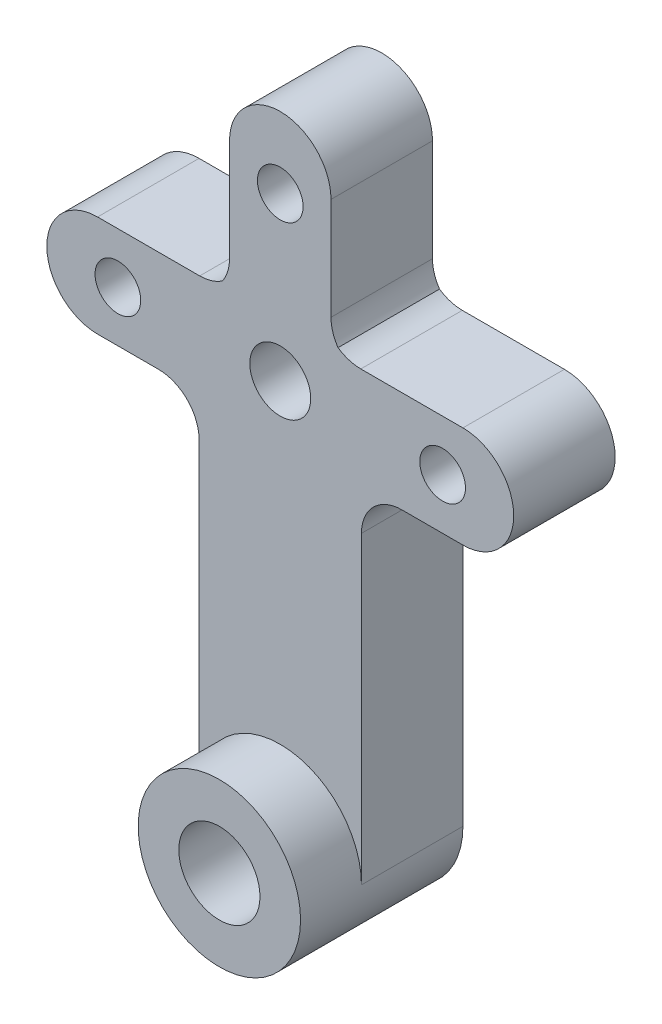
ISO-10303-21;
HEADER;
FILE_DESCRIPTION(('STEP AP214'),'2;1');
FILE_NAME('part.step','',(''),(''),'','','');
FILE_SCHEMA(('AUTOMOTIVE_DESIGN { 1 0 10303 214 1 1 1 1 }'));
ENDSEC;
DATA;
#1=APPLICATION_CONTEXT('core data for automotive mechanical design processes');
#2=APPLICATION_PROTOCOL_DEFINITION('international standard','automotive_design',2000,#1);
#3=PRODUCT_CONTEXT('',#1,'mechanical');
#4=PRODUCT('Part','Part','',(#3));
#5=PRODUCT_RELATED_PRODUCT_CATEGORY('part','',(#4));
#6=PRODUCT_DEFINITION_FORMATION('','',#4);
#7=PRODUCT_DEFINITION_CONTEXT('part definition',#1,'design');
#8=PRODUCT_DEFINITION('design','',#6,#7);
#9=PRODUCT_DEFINITION_SHAPE('','',#8);
#10=(LENGTH_UNIT() NAMED_UNIT(*) SI_UNIT(.MILLI.,.METRE.));
#11=(NAMED_UNIT(*) PLANE_ANGLE_UNIT() SI_UNIT($,.RADIAN.));
#12=(NAMED_UNIT(*) SI_UNIT($,.STERADIAN.) SOLID_ANGLE_UNIT());
#13=UNCERTAINTY_MEASURE_WITH_UNIT(LENGTH_MEASURE(1.E-05),#10,'distance_accuracy_value','');
#14=(GEOMETRIC_REPRESENTATION_CONTEXT(3) GLOBAL_UNCERTAINTY_ASSIGNED_CONTEXT((#13)) GLOBAL_UNIT_ASSIGNED_CONTEXT((#10,
#11,#12)) REPRESENTATION_CONTEXT('',''));
#15=CARTESIAN_POINT('',(0.,0.,0.));
#16=DIRECTION('',(0.,0.,1.));
#17=DIRECTION('',(1.,0.,0.));
#18=AXIS2_PLACEMENT_3D('',#15,#16,#17);
#19=CARTESIAN_POINT('',(0.,0.,5.));
#20=DIRECTION('',(0.,0.,1.));
#21=DIRECTION('',(1.,0.,0.));
#22=AXIS2_PLACEMENT_3D('',#19,#20,#21);
#23=PLANE('',#22);
#24=CARTESIAN_POINT('',(0.,-19.5,5.));
#25=DIRECTION('',(0.,0.,1.));
#26=DIRECTION('',(1.,0.,0.));
#27=AXIS2_PLACEMENT_3D('',#24,#25,#26);
#28=CIRCLE('',#27,4.);
#29=CARTESIAN_POINT('',(4.,-19.5,5.));
#30=VERTEX_POINT('',#29);
#31=CARTESIAN_POINT('',(-4.,-19.5,5.));
#32=VERTEX_POINT('',#31);
#33=EDGE_CURVE('E178',#30,#32,#28,.T.);
#34=ORIENTED_EDGE('',*,*,#33,.F.);
#35=DIRECTION('',(0.,-1.,0.));
#36=VECTOR('',#35,1.);
#37=CARTESIAN_POINT('',(4.,0.,5.));
#38=LINE('',#37,#36);
#39=CARTESIAN_POINT('',(4.,-4.5,5.));
#40=VERTEX_POINT('',#39);
#41=EDGE_CURVE('E189',#40,#30,#38,.T.);
#42=ORIENTED_EDGE('',*,*,#41,.F.);
#43=CARTESIAN_POINT('',(6.,-4.5,5.));
#44=DIRECTION('',(0.,0.,1.));
#45=DIRECTION('',(1.,0.,0.));
#46=AXIS2_PLACEMENT_3D('',#43,#44,#45);
#47=CIRCLE('',#46,2.);
#48=CARTESIAN_POINT('',(6.,-2.5,5.));
#49=VERTEX_POINT('',#48);
#50=EDGE_CURVE('E54',#40,#49,#47,.F.);
#51=ORIENTED_EDGE('',*,*,#50,.T.);
#52=DIRECTION('',(1.,0.,0.));
#53=VECTOR('',#52,1.);
#54=CARTESIAN_POINT('',(0.,-2.5,5.));
#55=LINE('',#54,#53);
#56=CARTESIAN_POINT('',(9.,-2.5,5.));
#57=VERTEX_POINT('',#56);
#58=EDGE_CURVE('E238',#49,#57,#55,.T.);
#59=ORIENTED_EDGE('',*,*,#58,.T.);
#60=CARTESIAN_POINT('',(9.,0.,5.));
#61=DIRECTION('',(0.,0.,1.));
#62=DIRECTION('',(1.,0.,0.));
#63=AXIS2_PLACEMENT_3D('',#60,#61,#62);
#64=CIRCLE('',#63,2.5);
#65=CARTESIAN_POINT('',(9.,2.5,5.));
#66=VERTEX_POINT('',#65);
#67=EDGE_CURVE('E241',#57,#66,#64,.T.);
#68=ORIENTED_EDGE('',*,*,#67,.T.);
#69=DIRECTION('',(1.,0.,0.));
#70=VECTOR('',#69,1.);
#71=CARTESIAN_POINT('',(0.,2.5,5.));
#72=LINE('',#71,#70);
#73=CARTESIAN_POINT('',(3.96862696659689,2.5,5.));
#74=VERTEX_POINT('',#73);
#75=EDGE_CURVE('E194',#74,#66,#72,.T.);
#76=ORIENTED_EDGE('',*,*,#75,.F.);
#77=CARTESIAN_POINT('',(3.96862696659689,4.5,5.));
#78=DIRECTION('',(0.,0.,1.));
#79=DIRECTION('',(1.,0.,0.));
#80=AXIS2_PLACEMENT_3D('',#77,#78,#79);
#81=CIRCLE('',#80,2.);
#82=CARTESIAN_POINT('',(2.84528120331248,2.84528120331248,5.));
#83=VERTEX_POINT('',#82);
#84=EDGE_CURVE('E70',#74,#83,#81,.F.);
#85=ORIENTED_EDGE('',*,*,#84,.T.);
#86=CARTESIAN_POINT('',(4.5,3.96862696659689,5.));
#87=DIRECTION('',(0.,0.,1.));
#88=DIRECTION('',(1.,0.,0.));
#89=AXIS2_PLACEMENT_3D('',#86,#87,#88);
#90=CIRCLE('',#89,2.);
#91=CARTESIAN_POINT('',(2.5,3.96862696659689,5.));
#92=VERTEX_POINT('',#91);
#93=EDGE_CURVE('E331',#83,#92,#90,.F.);
#94=ORIENTED_EDGE('',*,*,#93,.T.);
#95=DIRECTION('',(0.,1.,0.));
#96=VECTOR('',#95,1.);
#97=CARTESIAN_POINT('',(2.5,0.,5.));
#98=LINE('',#97,#96);
#99=CARTESIAN_POINT('',(2.5,9.,5.));
#100=VERTEX_POINT('',#99);
#101=EDGE_CURVE('E247',#92,#100,#98,.T.);
#102=ORIENTED_EDGE('',*,*,#101,.T.);
#103=CARTESIAN_POINT('',(0.,9.,5.));
#104=DIRECTION('',(0.,0.,1.));
#105=DIRECTION('',(1.,0.,0.));
#106=AXIS2_PLACEMENT_3D('',#103,#104,#105);
#107=CIRCLE('',#106,2.5);
#108=CARTESIAN_POINT('',(-2.5,9.,5.));
#109=VERTEX_POINT('',#108);
#110=EDGE_CURVE('E250',#100,#109,#107,.T.);
#111=ORIENTED_EDGE('',*,*,#110,.T.);
#112=DIRECTION('',(0.,1.,0.));
#113=VECTOR('',#112,1.);
#114=CARTESIAN_POINT('',(-2.5,0.,5.));
#115=LINE('',#114,#113);
#116=CARTESIAN_POINT('',(-2.5,3.96862696659689,5.));
#117=VERTEX_POINT('',#116);
#118=EDGE_CURVE('E223',#117,#109,#115,.T.);
#119=ORIENTED_EDGE('',*,*,#118,.F.);
#120=CARTESIAN_POINT('',(-4.5,3.96862696659689,5.));
#121=DIRECTION('',(0.,0.,1.));
#122=DIRECTION('',(1.,0.,0.));
#123=AXIS2_PLACEMENT_3D('',#120,#121,#122);
#124=CIRCLE('',#123,2.);
#125=CARTESIAN_POINT('',(-2.84528120331248,2.84528120331248,5.));
#126=VERTEX_POINT('',#125);
#127=EDGE_CURVE('E324',#117,#126,#124,.F.);
#128=ORIENTED_EDGE('',*,*,#127,.T.);
#129=CARTESIAN_POINT('',(-3.96862696659689,4.5,5.));
#130=DIRECTION('',(0.,0.,1.));
#131=DIRECTION('',(1.,0.,0.));
#132=AXIS2_PLACEMENT_3D('',#129,#130,#131);
#133=CIRCLE('',#132,2.);
#134=CARTESIAN_POINT('',(-3.96862696659689,2.5,5.));
#135=VERTEX_POINT('',#134);
#136=EDGE_CURVE('E320',#126,#135,#133,.F.);
#137=ORIENTED_EDGE('',*,*,#136,.T.);
#138=DIRECTION('',(-1.,0.,0.));
#139=VECTOR('',#138,1.);
#140=CARTESIAN_POINT('',(0.,2.5,5.));
#141=LINE('',#140,#139);
#142=CARTESIAN_POINT('',(-9.,2.5,5.));
#143=VERTEX_POINT('',#142);
#144=EDGE_CURVE('E226',#135,#143,#141,.T.);
#145=ORIENTED_EDGE('',*,*,#144,.T.);
#146=CARTESIAN_POINT('',(-9.,0.,5.));
#147=DIRECTION('',(0.,0.,1.));
#148=DIRECTION('',(1.,0.,0.));
#149=AXIS2_PLACEMENT_3D('',#146,#147,#148);
#150=CIRCLE('',#149,2.5);
#151=CARTESIAN_POINT('',(-9.,-2.5,5.));
#152=VERTEX_POINT('',#151);
#153=EDGE_CURVE('E230',#143,#152,#150,.T.);
#154=ORIENTED_EDGE('',*,*,#153,.T.);
#155=DIRECTION('',(-1.,0.,0.));
#156=VECTOR('',#155,1.);
#157=CARTESIAN_POINT('',(0.,-2.5,5.));
#158=LINE('',#157,#156);
#159=CARTESIAN_POINT('',(-6.,-2.5,5.));
#160=VERTEX_POINT('',#159);
#161=EDGE_CURVE('E193',#160,#152,#158,.T.);
#162=ORIENTED_EDGE('',*,*,#161,.F.);
#163=CARTESIAN_POINT('',(-6.,-4.5,5.));
#164=DIRECTION('',(0.,0.,1.));
#165=DIRECTION('',(1.,0.,0.));
#166=AXIS2_PLACEMENT_3D('',#163,#164,#165);
#167=CIRCLE('',#166,2.);
#168=CARTESIAN_POINT('',(-4.,-4.5,5.));
#169=VERTEX_POINT('',#168);
#170=EDGE_CURVE('E316',#160,#169,#167,.F.);
#171=ORIENTED_EDGE('',*,*,#170,.T.);
#172=DIRECTION('',(0.,-1.,0.));
#173=VECTOR('',#172,1.);
#174=CARTESIAN_POINT('',(-4.,0.,5.));
#175=LINE('',#174,#173);
#176=EDGE_CURVE('E198',#169,#32,#175,.T.);
#177=ORIENTED_EDGE('',*,*,#176,.T.);
#178=EDGE_LOOP('',(#34,#42,#51,#59,#68,#76,#85,#94,#102,#111,#119,#128,#137,#145,#154,#162,#171,#177));
#179=FACE_BOUND('',#178,.T.);
#180=CARTESIAN_POINT('',(-8.,0.,5.));
#181=DIRECTION('',(0.,0.,1.));
#182=DIRECTION('',(1.,0.,0.));
#183=AXIS2_PLACEMENT_3D('',#180,#181,#182);
#184=CIRCLE('',#183,1.125);
#185=CARTESIAN_POINT('',(-6.875,0.,5.));
#186=VERTEX_POINT('',#185);
#187=EDGE_CURVE('E209',#186,#186,#184,.T.);
#188=ORIENTED_EDGE('',*,*,#187,.F.);
#189=EDGE_LOOP('',(#188));
#190=FACE_BOUND('',#189,.T.);
#191=CARTESIAN_POINT('',(-2.20880571485205E-13,7.99999999999978,5.));
#192=DIRECTION('',(0.,0.,1.));
#193=DIRECTION('',(1.,0.,0.));
#194=AXIS2_PLACEMENT_3D('',#191,#192,#193);
#195=CIRCLE('',#194,1.125);
#196=CARTESIAN_POINT('',(1.12499999999978,7.99999999999978,5.));
#197=VERTEX_POINT('',#196);
#198=EDGE_CURVE('E213',#197,#197,#195,.T.);
#199=ORIENTED_EDGE('',*,*,#198,.F.);
#200=EDGE_LOOP('',(#199));
#201=FACE_BOUND('',#200,.T.);
#202=CARTESIAN_POINT('',(8.,0.,5.));
#203=DIRECTION('',(0.,0.,1.));
#204=DIRECTION('',(1.,0.,0.));
#205=AXIS2_PLACEMENT_3D('',#202,#203,#204);
#206=CIRCLE('',#205,1.125);
#207=CARTESIAN_POINT('',(9.125,0.,5.));
#208=VERTEX_POINT('',#207);
#209=EDGE_CURVE('E204',#208,#208,#206,.T.);
#210=ORIENTED_EDGE('',*,*,#209,.F.);
#211=EDGE_LOOP('',(#210));
#212=FACE_BOUND('',#211,.T.);
#213=CARTESIAN_POINT('',(0.,0.,5.));
#214=DIRECTION('',(0.,0.,1.));
#215=DIRECTION('',(1.,0.,0.));
#216=AXIS2_PLACEMENT_3D('',#213,#214,#215);
#217=CIRCLE('',#216,1.5);
#218=CARTESIAN_POINT('',(1.5,0.,5.));
#219=VERTEX_POINT('',#218);
#220=EDGE_CURVE('E291',#219,#219,#217,.T.);
#221=ORIENTED_EDGE('',*,*,#220,.F.);
#222=EDGE_LOOP('',(#221));
#223=FACE_BOUND('',#222,.T.);
#224=ADVANCED_FACE('F45',(#179,#190,#201,#212,#223),#23,.T.);
#225=CARTESIAN_POINT('',(0.,0.,0.));
#226=DIRECTION('',(0.,0.,1.));
#227=DIRECTION('',(1.,0.,0.));
#228=AXIS2_PLACEMENT_3D('',#225,#226,#227);
#229=PLANE('',#228);
#230=CARTESIAN_POINT('',(-8.,0.,0.));
#231=DIRECTION('',(0.,0.,1.));
#232=DIRECTION('',(1.,0.,0.));
#233=AXIS2_PLACEMENT_3D('',#230,#231,#232);
#234=CIRCLE('',#233,1.125);
#235=CARTESIAN_POINT('',(-6.875,0.,0.));
#236=VERTEX_POINT('',#235);
#237=EDGE_CURVE('E49',#236,#236,#234,.T.);
#238=ORIENTED_EDGE('',*,*,#237,.T.);
#239=EDGE_LOOP('',(#238));
#240=FACE_BOUND('',#239,.T.);
#241=CARTESIAN_POINT('',(-2.20880571485205E-13,7.99999999999978,0.));
#242=DIRECTION('',(0.,0.,1.));
#243=DIRECTION('',(1.,0.,0.));
#244=AXIS2_PLACEMENT_3D('',#241,#242,#243);
#245=CIRCLE('',#244,1.125);
#246=CARTESIAN_POINT('',(1.12499999999978,7.99999999999978,0.));
#247=VERTEX_POINT('',#246);
#248=EDGE_CURVE('E341',#247,#247,#245,.T.);
#249=ORIENTED_EDGE('',*,*,#248,.T.);
#250=EDGE_LOOP('',(#249));
#251=FACE_BOUND('',#250,.T.);
#252=CARTESIAN_POINT('',(8.,0.,0.));
#253=DIRECTION('',(0.,0.,1.));
#254=DIRECTION('',(1.,0.,0.));
#255=AXIS2_PLACEMENT_3D('',#252,#253,#254);
#256=CIRCLE('',#255,1.125);
#257=CARTESIAN_POINT('',(9.125,0.,0.));
#258=VERTEX_POINT('',#257);
#259=EDGE_CURVE('E212',#258,#258,#256,.T.);
#260=ORIENTED_EDGE('',*,*,#259,.T.);
#261=EDGE_LOOP('',(#260));
#262=FACE_BOUND('',#261,.T.);
#263=CARTESIAN_POINT('',(0.,-19.5,0.));
#264=DIRECTION('',(0.,0.,1.));
#265=DIRECTION('',(1.,0.,0.));
#266=AXIS2_PLACEMENT_3D('',#263,#264,#265);
#267=CIRCLE('',#266,2.);
#268=CARTESIAN_POINT('',(2.,-19.5,0.));
#269=VERTEX_POINT('',#268);
#270=EDGE_CURVE('E218',#269,#269,#267,.F.);
#271=ORIENTED_EDGE('',*,*,#270,.F.);
#272=EDGE_LOOP('',(#271));
#273=FACE_BOUND('',#272,.T.);
#274=CARTESIAN_POINT('',(0.,0.,0.));
#275=DIRECTION('',(0.,0.,1.));
#276=DIRECTION('',(1.,0.,0.));
#277=AXIS2_PLACEMENT_3D('',#274,#275,#276);
#278=CIRCLE('',#277,1.5);
#279=CARTESIAN_POINT('',(1.5,0.,0.));
#280=VERTEX_POINT('',#279);
#281=EDGE_CURVE('E295',#280,#280,#278,.F.);
#282=ORIENTED_EDGE('',*,*,#281,.F.);
#283=EDGE_LOOP('',(#282));
#284=FACE_BOUND('',#283,.T.);
#285=CARTESIAN_POINT('',(0.,9.,0.));
#286=DIRECTION('',(0.,0.,1.));
#287=DIRECTION('',(1.,0.,0.));
#288=AXIS2_PLACEMENT_3D('',#285,#286,#287);
#289=CIRCLE('',#288,2.5);
#290=CARTESIAN_POINT('',(-2.5,9.,0.));
#291=VERTEX_POINT('',#290);
#292=CARTESIAN_POINT('',(2.5,9.,0.));
#293=VERTEX_POINT('',#292);
#294=EDGE_CURVE('E221',#291,#293,#289,.F.);
#295=ORIENTED_EDGE('',*,*,#294,.T.);
#296=DIRECTION('',(0.,-1.,0.));
#297=VECTOR('',#296,1.);
#298=CARTESIAN_POINT('',(2.5,0.,0.));
#299=LINE('',#298,#297);
#300=CARTESIAN_POINT('',(2.5,3.96862696659689,0.));
#301=VERTEX_POINT('',#300);
#302=EDGE_CURVE('E249',#293,#301,#299,.T.);
#303=ORIENTED_EDGE('',*,*,#302,.T.);
#304=CARTESIAN_POINT('',(4.5,3.96862696659689,0.));
#305=DIRECTION('',(0.,0.,1.));
#306=DIRECTION('',(1.,0.,0.));
#307=AXIS2_PLACEMENT_3D('',#304,#305,#306);
#308=CIRCLE('',#307,2.);
#309=CARTESIAN_POINT('',(2.84528120331248,2.84528120331248,0.));
#310=VERTEX_POINT('',#309);
#311=EDGE_CURVE('E62',#301,#310,#308,.T.);
#312=ORIENTED_EDGE('',*,*,#311,.T.);
#313=CARTESIAN_POINT('',(3.96862696659689,4.5,0.));
#314=DIRECTION('',(0.,0.,1.));
#315=DIRECTION('',(1.,0.,0.));
#316=AXIS2_PLACEMENT_3D('',#313,#314,#315);
#317=CIRCLE('',#316,2.);
#318=CARTESIAN_POINT('',(3.96862696659689,2.5,0.));
#319=VERTEX_POINT('',#318);
#320=EDGE_CURVE('E329',#310,#319,#317,.T.);
#321=ORIENTED_EDGE('',*,*,#320,.T.);
#322=DIRECTION('',(-1.,0.,0.));
#323=VECTOR('',#322,1.);
#324=CARTESIAN_POINT('',(0.,2.5,0.));
#325=LINE('',#324,#323);
#326=CARTESIAN_POINT('',(9.,2.5,0.));
#327=VERTEX_POINT('',#326);
#328=EDGE_CURVE('E284',#327,#319,#325,.T.);
#329=ORIENTED_EDGE('',*,*,#328,.F.);
#330=CARTESIAN_POINT('',(9.,0.,0.));
#331=DIRECTION('',(0.,0.,1.));
#332=DIRECTION('',(1.,0.,0.));
#333=AXIS2_PLACEMENT_3D('',#330,#331,#332);
#334=CIRCLE('',#333,2.5);
#335=CARTESIAN_POINT('',(9.,-2.5,0.));
#336=VERTEX_POINT('',#335);
#337=EDGE_CURVE('E240',#327,#336,#334,.F.);
#338=ORIENTED_EDGE('',*,*,#337,.T.);
#339=DIRECTION('',(-1.,0.,0.));
#340=VECTOR('',#339,1.);
#341=CARTESIAN_POINT('',(0.,-2.5,0.));
#342=LINE('',#341,#340);
#343=CARTESIAN_POINT('',(6.,-2.5,0.));
#344=VERTEX_POINT('',#343);
#345=EDGE_CURVE('E184',#336,#344,#342,.T.);
#346=ORIENTED_EDGE('',*,*,#345,.T.);
#347=CARTESIAN_POINT('',(6.,-4.5,0.));
#348=DIRECTION('',(0.,0.,1.));
#349=DIRECTION('',(1.,0.,0.));
#350=AXIS2_PLACEMENT_3D('',#347,#348,#349);
#351=CIRCLE('',#350,2.);
#352=CARTESIAN_POINT('',(4.,-4.5,0.));
#353=VERTEX_POINT('',#352);
#354=EDGE_CURVE('E12',#344,#353,#351,.T.);
#355=ORIENTED_EDGE('',*,*,#354,.T.);
#356=DIRECTION('',(0.,1.,0.));
#357=VECTOR('',#356,1.);
#358=CARTESIAN_POINT('',(4.,0.,0.));
#359=LINE('',#358,#357);
#360=CARTESIAN_POINT('',(4.,-19.5,0.));
#361=VERTEX_POINT('',#360);
#362=EDGE_CURVE('E279',#361,#353,#359,.T.);
#363=ORIENTED_EDGE('',*,*,#362,.F.);
#364=CARTESIAN_POINT('',(0.,-19.5,0.));
#365=DIRECTION('',(0.,0.,1.));
#366=DIRECTION('',(1.,0.,0.));
#367=AXIS2_PLACEMENT_3D('',#364,#365,#366);
#368=CIRCLE('',#367,4.);
#369=CARTESIAN_POINT('',(-4.,-19.5,0.));
#370=VERTEX_POINT('',#369);
#371=EDGE_CURVE('E180',#361,#370,#368,.F.);
#372=ORIENTED_EDGE('',*,*,#371,.T.);
#373=DIRECTION('',(0.,1.,0.));
#374=VECTOR('',#373,1.);
#375=CARTESIAN_POINT('',(-4.,0.,0.));
#376=LINE('',#375,#374);
#377=CARTESIAN_POINT('',(-4.,-4.5,0.));
#378=VERTEX_POINT('',#377);
#379=EDGE_CURVE('E236',#370,#378,#376,.T.);
#380=ORIENTED_EDGE('',*,*,#379,.T.);
#381=CARTESIAN_POINT('',(-6.,-4.5,0.));
#382=DIRECTION('',(0.,0.,1.));
#383=DIRECTION('',(1.,0.,0.));
#384=AXIS2_PLACEMENT_3D('',#381,#382,#383);
#385=CIRCLE('',#384,2.);
#386=CARTESIAN_POINT('',(-6.,-2.5,0.));
#387=VERTEX_POINT('',#386);
#388=EDGE_CURVE('E318',#378,#387,#385,.T.);
#389=ORIENTED_EDGE('',*,*,#388,.T.);
#390=DIRECTION('',(1.,0.,0.));
#391=VECTOR('',#390,1.);
#392=CARTESIAN_POINT('',(0.,-2.5,0.));
#393=LINE('',#392,#391);
#394=CARTESIAN_POINT('',(-9.,-2.5,0.));
#395=VERTEX_POINT('',#394);
#396=EDGE_CURVE('E272',#395,#387,#393,.T.);
#397=ORIENTED_EDGE('',*,*,#396,.F.);
#398=CARTESIAN_POINT('',(-9.,0.,0.));
#399=DIRECTION('',(0.,0.,1.));
#400=DIRECTION('',(1.,0.,0.));
#401=AXIS2_PLACEMENT_3D('',#398,#399,#400);
#402=CIRCLE('',#401,2.5);
#403=CARTESIAN_POINT('',(-9.,2.5,0.));
#404=VERTEX_POINT('',#403);
#405=EDGE_CURVE('E228',#395,#404,#402,.F.);
#406=ORIENTED_EDGE('',*,*,#405,.T.);
#407=DIRECTION('',(1.,0.,0.));
#408=VECTOR('',#407,1.);
#409=CARTESIAN_POINT('',(0.,2.5,0.));
#410=LINE('',#409,#408);
#411=CARTESIAN_POINT('',(-3.96862696659689,2.5,0.));
#412=VERTEX_POINT('',#411);
#413=EDGE_CURVE('E229',#404,#412,#410,.T.);
#414=ORIENTED_EDGE('',*,*,#413,.T.);
#415=CARTESIAN_POINT('',(-3.96862696659689,4.5,0.));
#416=DIRECTION('',(0.,0.,1.));
#417=DIRECTION('',(1.,0.,0.));
#418=AXIS2_PLACEMENT_3D('',#415,#416,#417);
#419=CIRCLE('',#418,2.);
#420=CARTESIAN_POINT('',(-2.84528120331248,2.84528120331248,0.));
#421=VERTEX_POINT('',#420);
#422=EDGE_CURVE('E322',#412,#421,#419,.T.);
#423=ORIENTED_EDGE('',*,*,#422,.T.);
#424=CARTESIAN_POINT('',(-4.5,3.96862696659689,0.));
#425=DIRECTION('',(0.,0.,1.));
#426=DIRECTION('',(1.,0.,0.));
#427=AXIS2_PLACEMENT_3D('',#424,#425,#426);
#428=CIRCLE('',#427,2.);
#429=CARTESIAN_POINT('',(-2.5,3.96862696659689,0.));
#430=VERTEX_POINT('',#429);
#431=EDGE_CURVE('E326',#421,#430,#428,.T.);
#432=ORIENTED_EDGE('',*,*,#431,.T.);
#433=DIRECTION('',(0.,-1.,0.));
#434=VECTOR('',#433,1.);
#435=CARTESIAN_POINT('',(-2.5,0.,0.));
#436=LINE('',#435,#434);
#437=EDGE_CURVE('E225',#291,#430,#436,.T.);
#438=ORIENTED_EDGE('',*,*,#437,.F.);
#439=EDGE_LOOP('',(#295,#303,#312,#321,#329,#338,#346,#355,#363,#372,#380,#389,#397,#406,#414,
#423,#432,#438));
#440=FACE_BOUND('',#439,.T.);
#441=ADVANCED_FACE('F348',(#240,#251,#262,#273,#284,#440),#229,.F.);
#442=CARTESIAN_POINT('',(0.,0.,-4.24264068711928));
#443=DIRECTION('',(0.,0.,1.));
#444=DIRECTION('',(1.,0.,0.));
#445=AXIS2_PLACEMENT_3D('',#442,#443,#444);
#446=CYLINDRICAL_SURFACE('',#445,1.5);
#447=ORIENTED_EDGE('',*,*,#281,.T.);
#448=EDGE_LOOP('',(#447));
#449=FACE_BOUND('',#448,.T.);
#450=ORIENTED_EDGE('',*,*,#220,.T.);
#451=EDGE_LOOP('',(#450));
#452=FACE_BOUND('',#451,.T.);
#453=ADVANCED_FACE('F372',(#449,#452),#446,.F.);
#454=CARTESIAN_POINT('',(0.,9.,-74.2462120245875));
#455=DIRECTION('',(0.,0.,1.));
#456=DIRECTION('',(1.,0.,0.));
#457=AXIS2_PLACEMENT_3D('',#454,#455,#456);
#458=CYLINDRICAL_SURFACE('',#457,2.5);
#459=DIRECTION('',(0.,0.,1.));
#460=VECTOR('',#459,1.);
#461=CARTESIAN_POINT('',(-2.5,9.,-74.2462120245875));
#462=LINE('',#461,#460);
#463=EDGE_CURVE('E253',#291,#109,#462,.T.);
#464=ORIENTED_EDGE('',*,*,#463,.T.);
#465=ORIENTED_EDGE('',*,*,#110,.F.);
#466=DIRECTION('',(0.,0.,1.));
#467=VECTOR('',#466,1.);
#468=CARTESIAN_POINT('',(2.5,9.,-74.2462120245875));
#469=LINE('',#468,#467);
#470=EDGE_CURVE('E254',#293,#100,#469,.T.);
#471=ORIENTED_EDGE('',*,*,#470,.F.);
#472=ORIENTED_EDGE('',*,*,#294,.F.);
#473=EDGE_LOOP('',(#464,#465,#471,#472));
#474=FACE_BOUND('',#473,.T.);
#475=ADVANCED_FACE('F458',(#474),#458,.T.);
#476=CARTESIAN_POINT('',(-2.5,0.,-74.2462120245875));
#477=DIRECTION('',(1.,0.,0.));
#478=DIRECTION('',(0.,1.,0.));
#479=AXIS2_PLACEMENT_3D('',#476,#477,#478);
#480=PLANE('',#479);
#481=ORIENTED_EDGE('',*,*,#437,.T.);
#482=DIRECTION('',(0.,0.,1.));
#483=VECTOR('',#482,1.);
#484=CARTESIAN_POINT('',(-2.5,3.96862696659689,-74.2462120245875));
#485=LINE('',#484,#483);
#486=EDGE_CURVE('E306',#430,#117,#485,.T.);
#487=ORIENTED_EDGE('',*,*,#486,.T.);
#488=ORIENTED_EDGE('',*,*,#118,.T.);
#489=ORIENTED_EDGE('',*,*,#463,.F.);
#490=EDGE_LOOP('',(#481,#487,#488,#489));
#491=FACE_BOUND('',#490,.T.);
#492=ADVANCED_FACE('F455',(#491),#480,.F.);
#493=CARTESIAN_POINT('',(0.,2.5,-74.2462120245875));
#494=DIRECTION('',(0.,1.,0.));
#495=DIRECTION('',(-1.,0.,0.));
#496=AXIS2_PLACEMENT_3D('',#493,#494,#495);
#497=PLANE('',#496);
#498=ORIENTED_EDGE('',*,*,#144,.F.);
#499=DIRECTION('',(0.,0.,-1.));
#500=VECTOR('',#499,1.);
#501=CARTESIAN_POINT('',(-3.96862696659689,2.5,0.));
#502=LINE('',#501,#500);
#503=EDGE_CURVE('E303',#135,#412,#502,.T.);
#504=ORIENTED_EDGE('',*,*,#503,.T.);
#505=ORIENTED_EDGE('',*,*,#413,.F.);
#506=DIRECTION('',(0.,0.,1.));
#507=VECTOR('',#506,1.);
#508=CARTESIAN_POINT('',(-9.,2.5,-74.2462120245875));
#509=LINE('',#508,#507);
#510=EDGE_CURVE('E234',#404,#143,#509,.T.);
#511=ORIENTED_EDGE('',*,*,#510,.T.);
#512=EDGE_LOOP('',(#498,#504,#505,#511));
#513=FACE_BOUND('',#512,.T.);
#514=ADVANCED_FACE('F451',(#513),#497,.T.);
#515=CARTESIAN_POINT('',(-9.,0.,-74.2462120245875));
#516=DIRECTION('',(0.,0.,1.));
#517=DIRECTION('',(1.,0.,0.));
#518=AXIS2_PLACEMENT_3D('',#515,#516,#517);
#519=CYLINDRICAL_SURFACE('',#518,2.5);
#520=DIRECTION('',(0.,0.,1.));
#521=VECTOR('',#520,1.);
#522=CARTESIAN_POINT('',(-9.,-2.5,-74.2462120245875));
#523=LINE('',#522,#521);
#524=EDGE_CURVE('E233',#395,#152,#523,.T.);
#525=ORIENTED_EDGE('',*,*,#524,.T.);
#526=ORIENTED_EDGE('',*,*,#153,.F.);
#527=ORIENTED_EDGE('',*,*,#510,.F.);
#528=ORIENTED_EDGE('',*,*,#405,.F.);
#529=EDGE_LOOP('',(#525,#526,#527,#528));
#530=FACE_BOUND('',#529,.T.);
#531=ADVANCED_FACE('F447',(#530),#519,.T.);
#532=CARTESIAN_POINT('',(0.,-2.5,-74.2462120245875));
#533=DIRECTION('',(0.,1.,0.));
#534=DIRECTION('',(-1.,0.,0.));
#535=AXIS2_PLACEMENT_3D('',#532,#533,#534);
#536=PLANE('',#535);
#537=ORIENTED_EDGE('',*,*,#396,.T.);
#538=DIRECTION('',(0.,0.,1.));
#539=VECTOR('',#538,1.);
#540=CARTESIAN_POINT('',(-6.,-2.5,-74.2462120245875));
#541=LINE('',#540,#539);
#542=EDGE_CURVE('E298',#387,#160,#541,.T.);
#543=ORIENTED_EDGE('',*,*,#542,.T.);
#544=ORIENTED_EDGE('',*,*,#161,.T.);
#545=ORIENTED_EDGE('',*,*,#524,.F.);
#546=EDGE_LOOP('',(#537,#543,#544,#545));
#547=FACE_BOUND('',#546,.T.);
#548=ADVANCED_FACE('F443',(#547),#536,.F.);
#549=CARTESIAN_POINT('',(-4.,0.,-74.2462120245875));
#550=DIRECTION('',(-1.,0.,0.));
#551=DIRECTION('',(0.,-1.,0.));
#552=AXIS2_PLACEMENT_3D('',#549,#550,#551);
#553=PLANE('',#552);
#554=ORIENTED_EDGE('',*,*,#176,.F.);
#555=DIRECTION('',(0.,0.,1.));
#556=VECTOR('',#555,1.);
#557=CARTESIAN_POINT('',(-4.,-4.5,-74.2462120245875));
#558=LINE('',#557,#556);
#559=EDGE_CURVE('E301',#169,#378,#558,.F.);
#560=ORIENTED_EDGE('',*,*,#559,.T.);
#561=ORIENTED_EDGE('',*,*,#379,.F.);
#562=DIRECTION('',(0.,0.,1.));
#563=VECTOR('',#562,1.);
#564=CARTESIAN_POINT('',(-4.,-19.5,-74.2462120245875));
#565=LINE('',#564,#563);
#566=EDGE_CURVE('E185',#370,#32,#565,.T.);
#567=ORIENTED_EDGE('',*,*,#566,.T.);
#568=EDGE_LOOP('',(#554,#560,#561,#567));
#569=FACE_BOUND('',#568,.T.);
#570=ADVANCED_FACE('F441',(#569),#553,.T.);
#571=CARTESIAN_POINT('',(0.,-19.5,-74.2462120245875));
#572=DIRECTION('',(0.,0.,1.));
#573=DIRECTION('',(1.,0.,0.));
#574=AXIS2_PLACEMENT_3D('',#571,#572,#573);
#575=CYLINDRICAL_SURFACE('',#574,4.);
#576=DIRECTION('',(0.,0.,1.));
#577=VECTOR('',#576,1.);
#578=CARTESIAN_POINT('',(4.,-19.5,-74.2462120245875));
#579=LINE('',#578,#577);
#580=EDGE_CURVE('E172',#361,#30,#579,.T.);
#581=ORIENTED_EDGE('',*,*,#580,.T.);
#582=ORIENTED_EDGE('',*,*,#33,.T.);
#583=ORIENTED_EDGE('',*,*,#566,.F.);
#584=ORIENTED_EDGE('',*,*,#371,.F.);
#585=EDGE_LOOP('',(#581,#582,#583,#584));
#586=FACE_BOUND('',#585,.T.);
#587=CARTESIAN_POINT('',(0.,-19.5,8.));
#588=DIRECTION('',(0.,0.,1.));
#589=DIRECTION('',(1.,0.,0.));
#590=AXIS2_PLACEMENT_3D('',#587,#588,#589);
#591=CIRCLE('',#590,4.);
#592=CARTESIAN_POINT('',(4.,-19.5,8.));
#593=VERTEX_POINT('',#592);
#594=EDGE_CURVE('E200',#593,#593,#591,.T.);
#595=ORIENTED_EDGE('',*,*,#594,.F.);
#596=EDGE_LOOP('',(#595));
#597=FACE_BOUND('',#596,.T.);
#598=ADVANCED_FACE('F174',(#586,#597),#575,.T.);
#599=CARTESIAN_POINT('',(4.,0.,-74.2462120245875));
#600=DIRECTION('',(-1.,0.,0.));
#601=DIRECTION('',(0.,-1.,0.));
#602=AXIS2_PLACEMENT_3D('',#599,#600,#601);
#603=PLANE('',#602);
#604=ORIENTED_EDGE('',*,*,#362,.T.);
#605=DIRECTION('',(0.,0.,1.));
#606=VECTOR('',#605,1.);
#607=CARTESIAN_POINT('',(4.,-4.5,-74.2462120245875));
#608=LINE('',#607,#606);
#609=EDGE_CURVE('E192',#353,#40,#608,.T.);
#610=ORIENTED_EDGE('',*,*,#609,.T.);
#611=ORIENTED_EDGE('',*,*,#41,.T.);
#612=ORIENTED_EDGE('',*,*,#580,.F.);
#613=EDGE_LOOP('',(#604,#610,#611,#612));
#614=FACE_BOUND('',#613,.T.);
#615=ADVANCED_FACE('F190',(#614),#603,.F.);
#616=CARTESIAN_POINT('',(0.,-2.5,-74.2462120245875));
#617=DIRECTION('',(0.,-1.,0.));
#618=DIRECTION('',(0.,0.,-1.));
#619=AXIS2_PLACEMENT_3D('',#616,#617,#618);
#620=PLANE('',#619);
#621=ORIENTED_EDGE('',*,*,#58,.F.);
#622=DIRECTION('',(0.,0.,1.));
#623=VECTOR('',#622,1.);
#624=CARTESIAN_POINT('',(6.,-2.5,-74.2462120245875));
#625=LINE('',#624,#623);
#626=EDGE_CURVE('E314',#49,#344,#625,.F.);
#627=ORIENTED_EDGE('',*,*,#626,.T.);
#628=ORIENTED_EDGE('',*,*,#345,.F.);
#629=DIRECTION('',(0.,0.,1.));
#630=VECTOR('',#629,1.);
#631=CARTESIAN_POINT('',(9.,-2.5,-74.2462120245875));
#632=LINE('',#631,#630);
#633=EDGE_CURVE('E245',#336,#57,#632,.T.);
#634=ORIENTED_EDGE('',*,*,#633,.T.);
#635=EDGE_LOOP('',(#621,#627,#628,#634));
#636=FACE_BOUND('',#635,.T.);
#637=ADVANCED_FACE('F412',(#636),#620,.T.);
#638=CARTESIAN_POINT('',(9.,0.,-74.2462120245875));
#639=DIRECTION('',(0.,0.,1.));
#640=DIRECTION('',(1.,0.,0.));
#641=AXIS2_PLACEMENT_3D('',#638,#639,#640);
#642=CYLINDRICAL_SURFACE('',#641,2.5);
#643=DIRECTION('',(0.,0.,1.));
#644=VECTOR('',#643,1.);
#645=CARTESIAN_POINT('',(9.,2.5,-74.2462120245875));
#646=LINE('',#645,#644);
#647=EDGE_CURVE('E244',#327,#66,#646,.T.);
#648=ORIENTED_EDGE('',*,*,#647,.T.);
#649=ORIENTED_EDGE('',*,*,#67,.F.);
#650=ORIENTED_EDGE('',*,*,#633,.F.);
#651=ORIENTED_EDGE('',*,*,#337,.F.);
#652=EDGE_LOOP('',(#648,#649,#650,#651));
#653=FACE_BOUND('',#652,.T.);
#654=ADVANCED_FACE('F407',(#653),#642,.T.);
#655=CARTESIAN_POINT('',(0.,2.5,-74.2462120245875));
#656=DIRECTION('',(0.,-1.,0.));
#657=DIRECTION('',(0.,0.,-1.));
#658=AXIS2_PLACEMENT_3D('',#655,#656,#657);
#659=PLANE('',#658);
#660=ORIENTED_EDGE('',*,*,#328,.T.);
#661=DIRECTION('',(0.,0.,1.));
#662=VECTOR('',#661,1.);
#663=CARTESIAN_POINT('',(3.96862696659689,2.5,-74.2462120245875));
#664=LINE('',#663,#662);
#665=EDGE_CURVE('E308',#319,#74,#664,.T.);
#666=ORIENTED_EDGE('',*,*,#665,.T.);
#667=ORIENTED_EDGE('',*,*,#75,.T.);
#668=ORIENTED_EDGE('',*,*,#647,.F.);
#669=EDGE_LOOP('',(#660,#666,#667,#668));
#670=FACE_BOUND('',#669,.T.);
#671=ADVANCED_FACE('F404',(#670),#659,.F.);
#672=CARTESIAN_POINT('',(2.5,0.,-74.2462120245875));
#673=DIRECTION('',(1.,0.,0.));
#674=DIRECTION('',(0.,1.,0.));
#675=AXIS2_PLACEMENT_3D('',#672,#673,#674);
#676=PLANE('',#675);
#677=ORIENTED_EDGE('',*,*,#101,.F.);
#678=DIRECTION('',(0.,0.,-1.));
#679=VECTOR('',#678,1.);
#680=CARTESIAN_POINT('',(2.5,3.96862696659689,0.));
#681=LINE('',#680,#679);
#682=EDGE_CURVE('E311',#92,#301,#681,.T.);
#683=ORIENTED_EDGE('',*,*,#682,.T.);
#684=ORIENTED_EDGE('',*,*,#302,.F.);
#685=ORIENTED_EDGE('',*,*,#470,.T.);
#686=EDGE_LOOP('',(#677,#683,#684,#685));
#687=FACE_BOUND('',#686,.T.);
#688=ADVANCED_FACE('F427',(#687),#676,.T.);
#689=CARTESIAN_POINT('',(0.,-19.5,-74.2462120245875));
#690=DIRECTION('',(0.,0.,1.));
#691=DIRECTION('',(1.,0.,0.));
#692=AXIS2_PLACEMENT_3D('',#689,#690,#691);
#693=CYLINDRICAL_SURFACE('',#692,2.);
#694=ORIENTED_EDGE('',*,*,#270,.T.);
#695=EDGE_LOOP('',(#694));
#696=FACE_BOUND('',#695,.T.);
#697=CARTESIAN_POINT('',(0.,-19.5,8.));
#698=DIRECTION('',(0.,0.,1.));
#699=DIRECTION('',(1.,0.,0.));
#700=AXIS2_PLACEMENT_3D('',#697,#698,#699);
#701=CIRCLE('',#700,2.);
#702=CARTESIAN_POINT('',(2.,-19.5,8.));
#703=VERTEX_POINT('',#702);
#704=EDGE_CURVE('E201',#703,#703,#701,.T.);
#705=ORIENTED_EDGE('',*,*,#704,.T.);
#706=EDGE_LOOP('',(#705));
#707=FACE_BOUND('',#706,.T.);
#708=ADVANCED_FACE('F381',(#696,#707),#693,.F.);
#709=CARTESIAN_POINT('',(-6.,-4.5,-74.2462120245875));
#710=DIRECTION('',(0.,0.,1.));
#711=DIRECTION('',(1.,0.,0.));
#712=AXIS2_PLACEMENT_3D('',#709,#710,#711);
#713=CYLINDRICAL_SURFACE('',#712,2.);
#714=ORIENTED_EDGE('',*,*,#388,.F.);
#715=ORIENTED_EDGE('',*,*,#559,.F.);
#716=ORIENTED_EDGE('',*,*,#170,.F.);
#717=ORIENTED_EDGE('',*,*,#542,.F.);
#718=EDGE_LOOP('',(#714,#715,#716,#717));
#719=FACE_BOUND('',#718,.T.);
#720=ADVANCED_FACE('F377',(#719),#713,.F.);
#721=CARTESIAN_POINT('',(-4.5,3.96862696659689,-74.2462120245875));
#722=DIRECTION('',(0.,0.,1.));
#723=DIRECTION('',(1.,0.,0.));
#724=AXIS2_PLACEMENT_3D('',#721,#722,#723);
#725=CYLINDRICAL_SURFACE('',#724,2.);
#726=ORIENTED_EDGE('',*,*,#486,.F.);
#727=ORIENTED_EDGE('',*,*,#431,.F.);
#728=DIRECTION('',(0.,0.,1.));
#729=VECTOR('',#728,1.);
#730=CARTESIAN_POINT('',(-2.84528120331248,2.84528120331248,2.5));
#731=LINE('',#730,#729);
#732=EDGE_CURVE('E222',#126,#421,#731,.F.);
#733=ORIENTED_EDGE('',*,*,#732,.F.);
#734=ORIENTED_EDGE('',*,*,#127,.F.);
#735=EDGE_LOOP('',(#726,#727,#733,#734));
#736=FACE_BOUND('',#735,.T.);
#737=ADVANCED_FACE('F380',(#736),#725,.F.);
#738=CARTESIAN_POINT('',(-3.96862696659689,4.5,-74.2462120245875));
#739=DIRECTION('',(0.,0.,1.));
#740=DIRECTION('',(1.,0.,0.));
#741=AXIS2_PLACEMENT_3D('',#738,#739,#740);
#742=CYLINDRICAL_SURFACE('',#741,2.);
#743=ORIENTED_EDGE('',*,*,#422,.F.);
#744=ORIENTED_EDGE('',*,*,#503,.F.);
#745=ORIENTED_EDGE('',*,*,#136,.F.);
#746=ORIENTED_EDGE('',*,*,#732,.T.);
#747=EDGE_LOOP('',(#743,#744,#745,#746));
#748=FACE_BOUND('',#747,.T.);
#749=ADVANCED_FACE('F383',(#748),#742,.F.);
#750=CARTESIAN_POINT('',(4.5,3.96862696659689,-74.2462120245875));
#751=DIRECTION('',(0.,0.,1.));
#752=DIRECTION('',(1.,0.,0.));
#753=AXIS2_PLACEMENT_3D('',#750,#751,#752);
#754=CYLINDRICAL_SURFACE('',#753,2.);
#755=DIRECTION('',(0.,0.,1.));
#756=VECTOR('',#755,1.);
#757=CARTESIAN_POINT('',(2.84528120331248,2.84528120331248,2.5));
#758=LINE('',#757,#756);
#759=EDGE_CURVE('E337',#310,#83,#758,.T.);
#760=ORIENTED_EDGE('',*,*,#759,.F.);
#761=ORIENTED_EDGE('',*,*,#311,.F.);
#762=ORIENTED_EDGE('',*,*,#682,.F.);
#763=ORIENTED_EDGE('',*,*,#93,.F.);
#764=EDGE_LOOP('',(#760,#761,#762,#763));
#765=FACE_BOUND('',#764,.T.);
#766=ADVANCED_FACE('F386',(#765),#754,.F.);
#767=CARTESIAN_POINT('',(3.96862696659689,4.5,-74.2462120245875));
#768=DIRECTION('',(0.,0.,1.));
#769=DIRECTION('',(1.,0.,0.));
#770=AXIS2_PLACEMENT_3D('',#767,#768,#769);
#771=CYLINDRICAL_SURFACE('',#770,2.);
#772=ORIENTED_EDGE('',*,*,#320,.F.);
#773=ORIENTED_EDGE('',*,*,#759,.T.);
#774=ORIENTED_EDGE('',*,*,#84,.F.);
#775=ORIENTED_EDGE('',*,*,#665,.F.);
#776=EDGE_LOOP('',(#772,#773,#774,#775));
#777=FACE_BOUND('',#776,.T.);
#778=ADVANCED_FACE('F391',(#777),#771,.F.);
#779=CARTESIAN_POINT('',(6.,-4.5,-74.2462120245875));
#780=DIRECTION('',(0.,0.,1.));
#781=DIRECTION('',(1.,0.,0.));
#782=AXIS2_PLACEMENT_3D('',#779,#780,#781);
#783=CYLINDRICAL_SURFACE('',#782,2.);
#784=ORIENTED_EDGE('',*,*,#354,.F.);
#785=ORIENTED_EDGE('',*,*,#626,.F.);
#786=ORIENTED_EDGE('',*,*,#50,.F.);
#787=ORIENTED_EDGE('',*,*,#609,.F.);
#788=EDGE_LOOP('',(#784,#785,#786,#787));
#789=FACE_BOUND('',#788,.T.);
#790=ADVANCED_FACE('F47',(#789),#783,.F.);
#791=CARTESIAN_POINT('',(8.,0.,-5.));
#792=DIRECTION('',(0.,0.,1.));
#793=DIRECTION('',(1.,0.,0.));
#794=AXIS2_PLACEMENT_3D('',#791,#792,#793);
#795=CYLINDRICAL_SURFACE('',#794,1.125);
#796=ORIENTED_EDGE('',*,*,#209,.T.);
#797=EDGE_LOOP('',(#796));
#798=FACE_BOUND('',#797,.T.);
#799=ORIENTED_EDGE('',*,*,#259,.F.);
#800=EDGE_LOOP('',(#799));
#801=FACE_BOUND('',#800,.T.);
#802=ADVANCED_FACE('F363',(#798,#801),#795,.F.);
#803=CARTESIAN_POINT('',(-2.20880571485205E-13,7.99999999999978,-5.));
#804=DIRECTION('',(0.,0.,1.));
#805=DIRECTION('',(1.,0.,0.));
#806=AXIS2_PLACEMENT_3D('',#803,#804,#805);
#807=CYLINDRICAL_SURFACE('',#806,1.125);
#808=ORIENTED_EDGE('',*,*,#198,.T.);
#809=EDGE_LOOP('',(#808));
#810=FACE_BOUND('',#809,.T.);
#811=ORIENTED_EDGE('',*,*,#248,.F.);
#812=EDGE_LOOP('',(#811));
#813=FACE_BOUND('',#812,.T.);
#814=ADVANCED_FACE('F353',(#810,#813),#807,.F.);
#815=CARTESIAN_POINT('',(-8.,0.,-5.));
#816=DIRECTION('',(0.,0.,1.));
#817=DIRECTION('',(1.,0.,0.));
#818=AXIS2_PLACEMENT_3D('',#815,#816,#817);
#819=CYLINDRICAL_SURFACE('',#818,1.125);
#820=ORIENTED_EDGE('',*,*,#187,.T.);
#821=EDGE_LOOP('',(#820));
#822=FACE_BOUND('',#821,.T.);
#823=ORIENTED_EDGE('',*,*,#237,.F.);
#824=EDGE_LOOP('',(#823));
#825=FACE_BOUND('',#824,.T.);
#826=ADVANCED_FACE('F350',(#822,#825),#819,.F.);
#827=CARTESIAN_POINT('',(0.,-19.5,8.));
#828=DIRECTION('',(0.,0.,1.));
#829=DIRECTION('',(1.,0.,0.));
#830=AXIS2_PLACEMENT_3D('',#827,#828,#829);
#831=PLANE('',#830);
#832=ORIENTED_EDGE('',*,*,#594,.T.);
#833=EDGE_LOOP('',(#832));
#834=FACE_BOUND('',#833,.T.);
#835=ORIENTED_EDGE('',*,*,#704,.F.);
#836=EDGE_LOOP('',(#835));
#837=FACE_BOUND('',#836,.T.);
#838=ADVANCED_FACE('F352',(#834,#837),#831,.T.);
#839=CLOSED_SHELL('',(#224,#441,#453,#475,#492,#514,#531,#548,#570,#598,#615,#637,#654,#671,
#688,#708,#720,#737,#749,#766,#778,#790,#802,#814,#826,#838));
#840=MANIFOLD_SOLID_BREP('B2',#839);
#841=ADVANCED_BREP_SHAPE_REPRESENTATION('',(#18,#840),#14);
#842=SHAPE_DEFINITION_REPRESENTATION(#9,#841);
ENDSEC;
END-ISO-10303-21;
